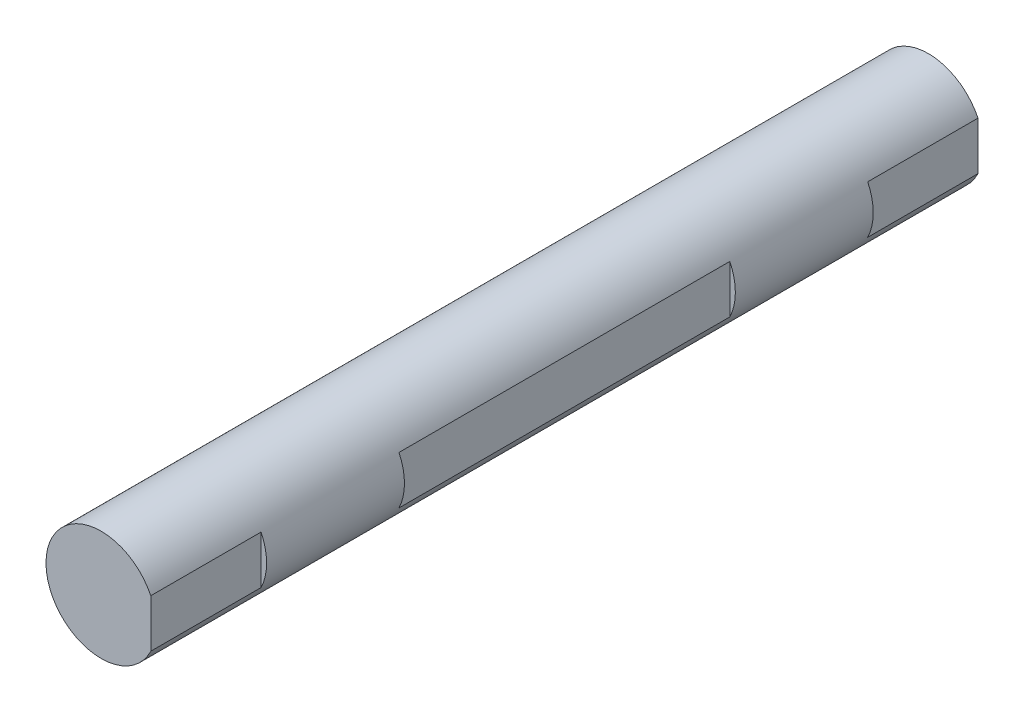
ISO-10303-21;
HEADER;
FILE_DESCRIPTION(('STEP AP214'),'2;1');
FILE_NAME('part.step','',(''),(''),'','','');
FILE_SCHEMA(('AUTOMOTIVE_DESIGN { 1 0 10303 214 1 1 1 1 }'));
ENDSEC;
DATA;
#1=APPLICATION_CONTEXT('core data for automotive mechanical design processes');
#2=APPLICATION_PROTOCOL_DEFINITION('international standard','automotive_design',2000,#1);
#3=PRODUCT_CONTEXT('',#1,'mechanical');
#4=PRODUCT('Part','Part','',(#3));
#5=PRODUCT_RELATED_PRODUCT_CATEGORY('part','',(#4));
#6=PRODUCT_DEFINITION_FORMATION('','',#4);
#7=PRODUCT_DEFINITION_CONTEXT('part definition',#1,'design');
#8=PRODUCT_DEFINITION('design','',#6,#7);
#9=PRODUCT_DEFINITION_SHAPE('','',#8);
#10=(LENGTH_UNIT() NAMED_UNIT(*) SI_UNIT(.MILLI.,.METRE.));
#11=(NAMED_UNIT(*) PLANE_ANGLE_UNIT() SI_UNIT($,.RADIAN.));
#12=(NAMED_UNIT(*) SI_UNIT($,.STERADIAN.) SOLID_ANGLE_UNIT());
#13=UNCERTAINTY_MEASURE_WITH_UNIT(LENGTH_MEASURE(1.E-05),#10,'distance_accuracy_value','');
#14=(GEOMETRIC_REPRESENTATION_CONTEXT(3) GLOBAL_UNCERTAINTY_ASSIGNED_CONTEXT((#13)) GLOBAL_UNIT_ASSIGNED_CONTEXT((#10,
#11,#12)) REPRESENTATION_CONTEXT('',''));
#15=CARTESIAN_POINT('',(0.,0.,0.));
#16=DIRECTION('',(0.,0.,1.));
#17=DIRECTION('',(1.,0.,0.));
#18=AXIS2_PLACEMENT_3D('',#15,#16,#17);
#19=CARTESIAN_POINT('',(0.,0.,75.));
#20=DIRECTION('',(0.,0.,-1.));
#21=DIRECTION('',(-1.,0.,0.));
#22=AXIS2_PLACEMENT_3D('',#19,#20,#21);
#23=CYLINDRICAL_SURFACE('',#22,5.);
#24=CARTESIAN_POINT('',(0.,0.,9.99999999999999));
#25=DIRECTION('',(0.,0.,1.));
#26=DIRECTION('',(1.,0.,0.));
#27=AXIS2_PLACEMENT_3D('',#24,#25,#26);
#28=CIRCLE('',#27,5.);
#29=CARTESIAN_POINT('',(4.5,-2.17944947177034,10.));
#30=VERTEX_POINT('',#29);
#31=CARTESIAN_POINT('',(4.5,2.17944947177034,10.));
#32=VERTEX_POINT('',#31);
#33=EDGE_CURVE('E99',#30,#32,#28,.T.);
#34=ORIENTED_EDGE('',*,*,#33,.T.);
#35=DIRECTION('',(0.,0.,-1.));
#36=VECTOR('',#35,1.);
#37=CARTESIAN_POINT('',(4.5,2.17944947177034,75.));
#38=LINE('',#37,#36);
#39=CARTESIAN_POINT('',(4.5,2.17944947177034,0.));
#40=VERTEX_POINT('',#39);
#41=EDGE_CURVE('E103',#40,#32,#38,.F.);
#42=ORIENTED_EDGE('',*,*,#41,.F.);
#43=CARTESIAN_POINT('',(0.,0.,0.));
#44=DIRECTION('',(0.,0.,1.));
#45=DIRECTION('',(1.,0.,0.));
#46=AXIS2_PLACEMENT_3D('',#43,#44,#45);
#47=CIRCLE('',#46,5.);
#48=CARTESIAN_POINT('',(4.5,-2.17944947177034,0.));
#49=VERTEX_POINT('',#48);
#50=EDGE_CURVE('E129',#40,#49,#47,.T.);
#51=ORIENTED_EDGE('',*,*,#50,.T.);
#52=DIRECTION('',(0.,0.,-1.));
#53=VECTOR('',#52,1.);
#54=CARTESIAN_POINT('',(4.5,-2.17944947177034,75.));
#55=LINE('',#54,#53);
#56=EDGE_CURVE('E105',#30,#49,#55,.T.);
#57=ORIENTED_EDGE('',*,*,#56,.F.);
#58=EDGE_LOOP('',(#34,#42,#51,#57));
#59=FACE_BOUND('',#58,.T.);
#60=DIRECTION('',(0.,0.,-1.));
#61=VECTOR('',#60,1.);
#62=CARTESIAN_POINT('',(4.5,2.17944947177034,75.));
#63=LINE('',#62,#61);
#64=CARTESIAN_POINT('',(4.5,2.17944947177034,52.5));
#65=VERTEX_POINT('',#64);
#66=CARTESIAN_POINT('',(4.5,2.17944947177034,22.5));
#67=VERTEX_POINT('',#66);
#68=EDGE_CURVE('E53',#65,#67,#63,.T.);
#69=ORIENTED_EDGE('',*,*,#68,.T.);
#70=CARTESIAN_POINT('',(0.,0.,22.5));
#71=DIRECTION('',(0.,0.,1.));
#72=DIRECTION('',(1.,0.,0.));
#73=AXIS2_PLACEMENT_3D('',#70,#71,#72);
#74=CIRCLE('',#73,5.);
#75=CARTESIAN_POINT('',(4.5,-2.17944947177034,22.5));
#76=VERTEX_POINT('',#75);
#77=EDGE_CURVE('E137',#76,#67,#74,.T.);
#78=ORIENTED_EDGE('',*,*,#77,.F.);
#79=DIRECTION('',(0.,0.,-1.));
#80=VECTOR('',#79,1.);
#81=CARTESIAN_POINT('',(4.5,-2.17944947177034,75.));
#82=LINE('',#81,#80);
#83=CARTESIAN_POINT('',(4.5,-2.17944947177034,52.5));
#84=VERTEX_POINT('',#83);
#85=EDGE_CURVE('E139',#76,#84,#82,.F.);
#86=ORIENTED_EDGE('',*,*,#85,.T.);
#87=CARTESIAN_POINT('',(0.,0.,52.5));
#88=DIRECTION('',(0.,0.,1.));
#89=DIRECTION('',(1.,0.,0.));
#90=AXIS2_PLACEMENT_3D('',#87,#88,#89);
#91=CIRCLE('',#90,5.);
#92=EDGE_CURVE('E109',#84,#65,#91,.T.);
#93=ORIENTED_EDGE('',*,*,#92,.T.);
#94=EDGE_LOOP('',(#69,#78,#86,#93));
#95=FACE_BOUND('',#94,.T.);
#96=DIRECTION('',(0.,0.,-1.));
#97=VECTOR('',#96,1.);
#98=CARTESIAN_POINT('',(4.5,2.17944947177034,75.));
#99=LINE('',#98,#97);
#100=CARTESIAN_POINT('',(4.5,2.17944947177034,65.));
#101=VERTEX_POINT('',#100);
#102=CARTESIAN_POINT('',(4.5,2.17944947177034,75.));
#103=VERTEX_POINT('',#102);
#104=EDGE_CURVE('E68',#101,#103,#99,.F.);
#105=ORIENTED_EDGE('',*,*,#104,.F.);
#106=CARTESIAN_POINT('',(0.,0.,65.));
#107=DIRECTION('',(0.,0.,1.));
#108=DIRECTION('',(1.,0.,0.));
#109=AXIS2_PLACEMENT_3D('',#106,#107,#108);
#110=CIRCLE('',#109,5.);
#111=CARTESIAN_POINT('',(4.5,-2.17944947177034,65.));
#112=VERTEX_POINT('',#111);
#113=EDGE_CURVE('E11',#112,#101,#110,.T.);
#114=ORIENTED_EDGE('',*,*,#113,.F.);
#115=DIRECTION('',(0.,0.,-1.));
#116=VECTOR('',#115,1.);
#117=CARTESIAN_POINT('',(4.5,-2.17944947177034,75.));
#118=LINE('',#117,#116);
#119=CARTESIAN_POINT('',(4.5,-2.17944947177034,75.));
#120=VERTEX_POINT('',#119);
#121=EDGE_CURVE('E127',#120,#112,#118,.T.);
#122=ORIENTED_EDGE('',*,*,#121,.F.);
#123=CARTESIAN_POINT('',(0.,0.,75.));
#124=DIRECTION('',(0.,0.,1.));
#125=DIRECTION('',(1.,0.,0.));
#126=AXIS2_PLACEMENT_3D('',#123,#124,#125);
#127=CIRCLE('',#126,5.);
#128=EDGE_CURVE('E130',#103,#120,#127,.T.);
#129=ORIENTED_EDGE('',*,*,#128,.F.);
#130=EDGE_LOOP('',(#105,#114,#122,#129));
#131=FACE_BOUND('',#130,.T.);
#132=ADVANCED_FACE('F46',(#59,#95,#131),#23,.T.);
#133=CARTESIAN_POINT('',(0.,0.,75.));
#134=DIRECTION('',(0.,0.,1.));
#135=DIRECTION('',(1.,0.,0.));
#136=AXIS2_PLACEMENT_3D('',#133,#134,#135);
#137=PLANE('',#136);
#138=ORIENTED_EDGE('',*,*,#128,.T.);
#139=DIRECTION('',(0.,1.,0.));
#140=VECTOR('',#139,1.);
#141=CARTESIAN_POINT('',(4.5,0.,75.));
#142=LINE('',#141,#140);
#143=EDGE_CURVE('E110',#120,#103,#142,.T.);
#144=ORIENTED_EDGE('',*,*,#143,.T.);
#145=EDGE_LOOP('',(#138,#144));
#146=FACE_BOUND('',#145,.T.);
#147=ADVANCED_FACE('F159',(#146),#137,.T.);
#148=CARTESIAN_POINT('',(0.,0.,0.));
#149=DIRECTION('',(0.,0.,1.));
#150=DIRECTION('',(1.,0.,0.));
#151=AXIS2_PLACEMENT_3D('',#148,#149,#150);
#152=PLANE('',#151);
#153=DIRECTION('',(0.,1.,0.));
#154=VECTOR('',#153,1.);
#155=CARTESIAN_POINT('',(4.5,0.,0.));
#156=LINE('',#155,#154);
#157=EDGE_CURVE('E116',#49,#40,#156,.T.);
#158=ORIENTED_EDGE('',*,*,#157,.F.);
#159=ORIENTED_EDGE('',*,*,#50,.F.);
#160=EDGE_LOOP('',(#158,#159));
#161=FACE_BOUND('',#160,.T.);
#162=ADVANCED_FACE('F173',(#161),#152,.F.);
#163=CARTESIAN_POINT('',(4.5,5.00000000000001,10.));
#164=DIRECTION('',(0.,0.,1.));
#165=DIRECTION('',(1.,0.,0.));
#166=AXIS2_PLACEMENT_3D('',#163,#164,#165);
#167=PLANE('',#166);
#168=ORIENTED_EDGE('',*,*,#33,.F.);
#169=DIRECTION('',(0.,-1.,0.));
#170=VECTOR('',#169,1.);
#171=CARTESIAN_POINT('',(4.5,5.00000000000001,10.));
#172=LINE('',#171,#170);
#173=EDGE_CURVE('E114',#32,#30,#172,.T.);
#174=ORIENTED_EDGE('',*,*,#173,.F.);
#175=EDGE_LOOP('',(#168,#174));
#176=FACE_BOUND('',#175,.T.);
#177=ADVANCED_FACE('F119',(#176),#167,.F.);
#178=CARTESIAN_POINT('',(4.5,0.,0.));
#179=DIRECTION('',(1.,0.,0.));
#180=DIRECTION('',(0.,0.,-1.));
#181=AXIS2_PLACEMENT_3D('',#178,#179,#180);
#182=PLANE('',#181);
#183=ORIENTED_EDGE('',*,*,#56,.T.);
#184=ORIENTED_EDGE('',*,*,#157,.T.);
#185=ORIENTED_EDGE('',*,*,#41,.T.);
#186=ORIENTED_EDGE('',*,*,#173,.T.);
#187=EDGE_LOOP('',(#183,#184,#185,#186));
#188=FACE_BOUND('',#187,.T.);
#189=ADVANCED_FACE('F113',(#188),#182,.T.);
#190=CARTESIAN_POINT('',(4.5,5.00000000000001,65.));
#191=DIRECTION('',(0.,0.,1.));
#192=DIRECTION('',(1.,0.,0.));
#193=AXIS2_PLACEMENT_3D('',#190,#191,#192);
#194=PLANE('',#193);
#195=ORIENTED_EDGE('',*,*,#113,.T.);
#196=DIRECTION('',(0.,-1.,0.));
#197=VECTOR('',#196,1.);
#198=CARTESIAN_POINT('',(4.5,5.00000000000001,65.));
#199=LINE('',#198,#197);
#200=EDGE_CURVE('E117',#101,#112,#199,.T.);
#201=ORIENTED_EDGE('',*,*,#200,.T.);
#202=EDGE_LOOP('',(#195,#201));
#203=FACE_BOUND('',#202,.T.);
#204=ADVANCED_FACE('F155',(#203),#194,.T.);
#205=CARTESIAN_POINT('',(4.5,0.,0.));
#206=DIRECTION('',(1.,0.,0.));
#207=DIRECTION('',(0.,0.,-1.));
#208=AXIS2_PLACEMENT_3D('',#205,#206,#207);
#209=PLANE('',#208);
#210=ORIENTED_EDGE('',*,*,#121,.T.);
#211=ORIENTED_EDGE('',*,*,#200,.F.);
#212=ORIENTED_EDGE('',*,*,#104,.T.);
#213=ORIENTED_EDGE('',*,*,#143,.F.);
#214=EDGE_LOOP('',(#210,#211,#212,#213));
#215=FACE_BOUND('',#214,.T.);
#216=ADVANCED_FACE('F160',(#215),#209,.T.);
#217=CARTESIAN_POINT('',(4.5,4.99999999999999,22.5));
#218=DIRECTION('',(0.,0.,1.));
#219=DIRECTION('',(1.,0.,0.));
#220=AXIS2_PLACEMENT_3D('',#217,#218,#219);
#221=PLANE('',#220);
#222=ORIENTED_EDGE('',*,*,#77,.T.);
#223=DIRECTION('',(0.,-1.,0.));
#224=VECTOR('',#223,1.);
#225=CARTESIAN_POINT('',(4.5,4.99999999999999,22.5));
#226=LINE('',#225,#224);
#227=EDGE_CURVE('E121',#67,#76,#226,.T.);
#228=ORIENTED_EDGE('',*,*,#227,.T.);
#229=EDGE_LOOP('',(#222,#228));
#230=FACE_BOUND('',#229,.T.);
#231=ADVANCED_FACE('F150',(#230),#221,.T.);
#232=CARTESIAN_POINT('',(4.5,4.99999999999999,52.5));
#233=DIRECTION('',(0.,0.,1.));
#234=DIRECTION('',(1.,0.,0.));
#235=AXIS2_PLACEMENT_3D('',#232,#233,#234);
#236=PLANE('',#235);
#237=ORIENTED_EDGE('',*,*,#92,.F.);
#238=DIRECTION('',(0.,-1.,0.));
#239=VECTOR('',#238,1.);
#240=CARTESIAN_POINT('',(4.5,4.99999999999999,52.5));
#241=LINE('',#240,#239);
#242=EDGE_CURVE('E60',#65,#84,#241,.T.);
#243=ORIENTED_EDGE('',*,*,#242,.F.);
#244=EDGE_LOOP('',(#237,#243));
#245=FACE_BOUND('',#244,.T.);
#246=ADVANCED_FACE('F148',(#245),#236,.F.);
#247=CARTESIAN_POINT('',(4.5,0.,0.));
#248=DIRECTION('',(-1.,0.,0.));
#249=DIRECTION('',(0.,0.,1.));
#250=AXIS2_PLACEMENT_3D('',#247,#248,#249);
#251=PLANE('',#250);
#252=ORIENTED_EDGE('',*,*,#242,.T.);
#253=ORIENTED_EDGE('',*,*,#85,.F.);
#254=ORIENTED_EDGE('',*,*,#227,.F.);
#255=ORIENTED_EDGE('',*,*,#68,.F.);
#256=EDGE_LOOP('',(#252,#253,#254,#255));
#257=FACE_BOUND('',#256,.T.);
#258=ADVANCED_FACE('F145',(#257),#251,.F.);
#259=CLOSED_SHELL('',(#132,#147,#162,#177,#189,#204,#216,#231,#246,#258));
#260=MANIFOLD_SOLID_BREP('B2',#259);
#261=ADVANCED_BREP_SHAPE_REPRESENTATION('',(#18,#260),#14);
#262=SHAPE_DEFINITION_REPRESENTATION(#9,#261);
ENDSEC;
END-ISO-10303-21;
